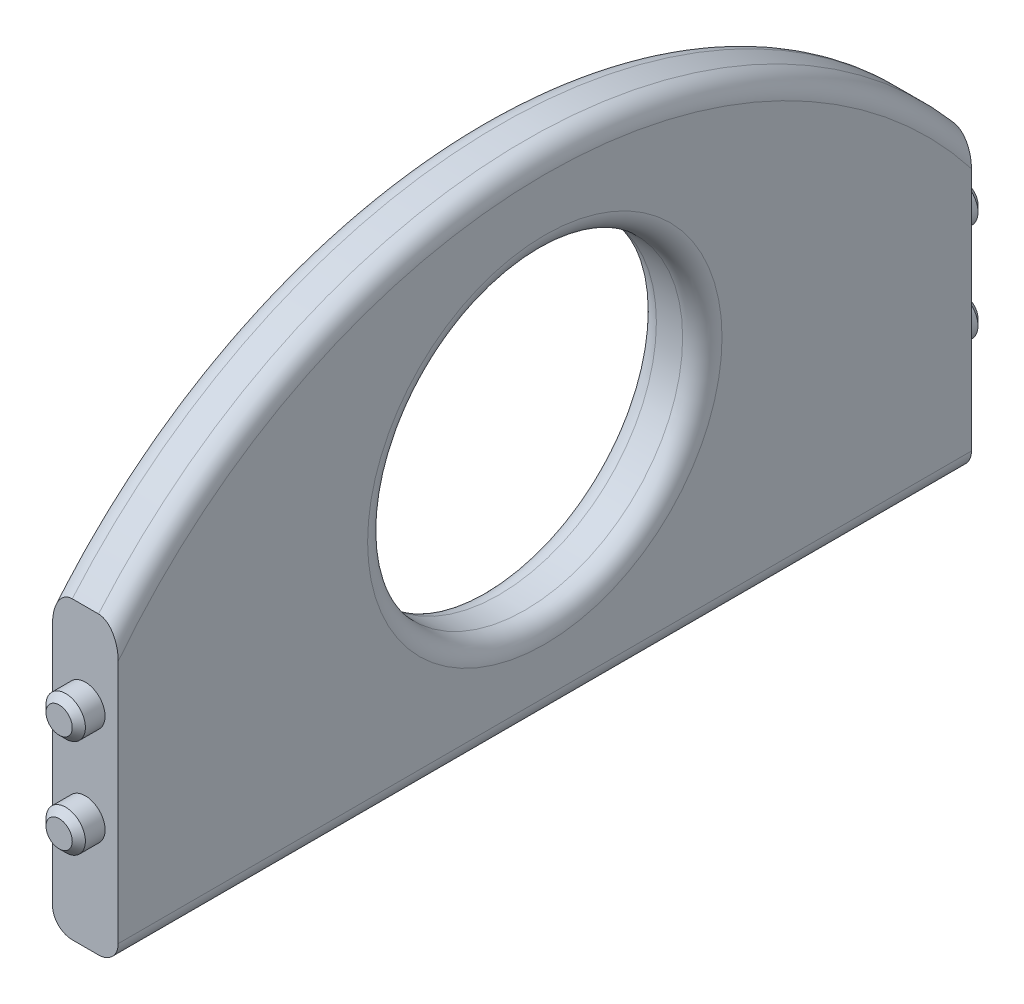
ISO-10303-21;
HEADER;
FILE_DESCRIPTION(('STEP AP214'),'2;1');
FILE_NAME('part.step','',(''),(''),'','','');
FILE_SCHEMA(('AUTOMOTIVE_DESIGN { 1 0 10303 214 1 1 1 1 }'));
ENDSEC;
DATA;
#1=APPLICATION_CONTEXT('core data for automotive mechanical design processes');
#2=APPLICATION_PROTOCOL_DEFINITION('international standard','automotive_design',2000,#1);
#3=PRODUCT_CONTEXT('',#1,'mechanical');
#4=PRODUCT('Part','Part','',(#3));
#5=PRODUCT_RELATED_PRODUCT_CATEGORY('part','',(#4));
#6=PRODUCT_DEFINITION_FORMATION('','',#4);
#7=PRODUCT_DEFINITION_CONTEXT('part definition',#1,'design');
#8=PRODUCT_DEFINITION('design','',#6,#7);
#9=PRODUCT_DEFINITION_SHAPE('','',#8);
#10=(LENGTH_UNIT() NAMED_UNIT(*) SI_UNIT(.MILLI.,.METRE.));
#11=(NAMED_UNIT(*) PLANE_ANGLE_UNIT() SI_UNIT($,.RADIAN.));
#12=(NAMED_UNIT(*) SI_UNIT($,.STERADIAN.) SOLID_ANGLE_UNIT());
#13=UNCERTAINTY_MEASURE_WITH_UNIT(LENGTH_MEASURE(1.E-05),#10,'distance_accuracy_value','');
#14=(GEOMETRIC_REPRESENTATION_CONTEXT(3) GLOBAL_UNCERTAINTY_ASSIGNED_CONTEXT((#13)) GLOBAL_UNIT_ASSIGNED_CONTEXT((#10,
#11,#12)) REPRESENTATION_CONTEXT('',''));
#15=CARTESIAN_POINT('',(0.,0.,0.));
#16=DIRECTION('',(0.,0.,1.));
#17=DIRECTION('',(1.,0.,0.));
#18=AXIS2_PLACEMENT_3D('',#15,#16,#17);
#19=CARTESIAN_POINT('',(5.,45.,65.));
#20=DIRECTION('',(0.,0.,-1.));
#21=DIRECTION('',(-1.,0.,0.));
#22=AXIS2_PLACEMENT_3D('',#19,#20,#21);
#23=PLANE('',#22);
#24=CARTESIAN_POINT('',(0.,32.,65.));
#25=DIRECTION('',(0.,0.,-1.));
#26=DIRECTION('',(-1.,0.,0.));
#27=AXIS2_PLACEMENT_3D('',#24,#25,#26);
#28=CIRCLE('',#27,3.);
#29=CARTESIAN_POINT('',(-3.,32.,65.));
#30=VERTEX_POINT('',#29);
#31=EDGE_CURVE('E245',#30,#30,#28,.F.);
#32=ORIENTED_EDGE('',*,*,#31,.F.);
#33=EDGE_LOOP('',(#32));
#34=FACE_BOUND('',#33,.T.);
#35=DIRECTION('',(0.,-1.,0.));
#36=VECTOR('',#35,1.);
#37=CARTESIAN_POINT('',(-5.,45.,65.));
#38=LINE('',#37,#36);
#39=CARTESIAN_POINT('',(-5.,40.2539060994314,65.));
#40=VERTEX_POINT('',#39);
#41=CARTESIAN_POINT('',(-5.,3.00000000000002,65.));
#42=VERTEX_POINT('',#41);
#43=EDGE_CURVE('E117',#40,#42,#38,.T.);
#44=ORIENTED_EDGE('',*,*,#43,.T.);
#45=CARTESIAN_POINT('',(-2.,3.,65.));
#46=DIRECTION('',(0.,0.,-1.));
#47=DIRECTION('',(-1.,0.,0.));
#48=AXIS2_PLACEMENT_3D('',#45,#46,#47);
#49=CIRCLE('',#48,3.);
#50=CARTESIAN_POINT('',(-2.,0.,65.));
#51=VERTEX_POINT('',#50);
#52=EDGE_CURVE('E121',#42,#51,#49,.F.);
#53=ORIENTED_EDGE('',*,*,#52,.T.);
#54=DIRECTION('',(-1.,0.,0.));
#55=VECTOR('',#54,1.);
#56=CARTESIAN_POINT('',(5.,0.,65.));
#57=LINE('',#56,#55);
#58=CARTESIAN_POINT('',(2.,0.,65.));
#59=VERTEX_POINT('',#58);
#60=EDGE_CURVE('E291',#59,#51,#57,.T.);
#61=ORIENTED_EDGE('',*,*,#60,.F.);
#62=CARTESIAN_POINT('',(2.,3.,65.));
#63=DIRECTION('',(0.,0.,-1.));
#64=DIRECTION('',(-1.,0.,0.));
#65=AXIS2_PLACEMENT_3D('',#62,#63,#64);
#66=CIRCLE('',#65,3.);
#67=CARTESIAN_POINT('',(5.,3.00000000000002,65.));
#68=VERTEX_POINT('',#67);
#69=EDGE_CURVE('E189',#59,#68,#66,.F.);
#70=ORIENTED_EDGE('',*,*,#69,.T.);
#71=DIRECTION('',(0.,-1.,0.));
#72=VECTOR('',#71,1.);
#73=CARTESIAN_POINT('',(5.,45.,65.));
#74=LINE('',#73,#72);
#75=CARTESIAN_POINT('',(5.,40.2539060994314,65.));
#76=VERTEX_POINT('',#75);
#77=EDGE_CURVE('E116',#76,#68,#74,.T.);
#78=ORIENTED_EDGE('',*,*,#77,.F.);
#79=CARTESIAN_POINT('',(5.,40.2539060994314,65.));
#80=CARTESIAN_POINT('',(4.99999557512889,40.358503037264,65.));
#81=CARTESIAN_POINT('',(4.99793249668532,40.463089252755,65.));
#82=CARTESIAN_POINT('',(4.98960836084726,40.6721091068507,65.));
#83=CARTESIAN_POINT('',(4.98334669464615,40.7765427211265,65.));
#84=CARTESIAN_POINT('',(4.95809486676426,41.0899779035369,65.));
#85=CARTESIAN_POINT('',(4.93263689556529,41.2985046166608,65.));
#86=CARTESIAN_POINT('',(4.86305788857343,41.7152133252635,65.));
#87=CARTESIAN_POINT('',(4.81869880997356,41.9233556863235,65.));
#88=CARTESIAN_POINT('',(4.7097917309633,42.3341019363939,65.));
#89=CARTESIAN_POINT('',(4.64527425385712,42.5367136986623,65.));
#90=CARTESIAN_POINT('',(4.53130442027821,42.8355112970627,65.));
#91=CARTESIAN_POINT('',(4.49012523695941,42.9348832731109,65.));
#92=CARTESIAN_POINT('',(4.40171558662986,43.1308826903725,65.));
#93=CARTESIAN_POINT('',(4.35448512121664,43.2275101323103,65.));
#94=CARTESIAN_POINT('',(4.20344490498561,43.5117804961347,65.));
#95=CARTESIAN_POINT('',(4.09001177791011,43.6945541106818,65.));
#96=CARTESIAN_POINT('',(3.86128731810569,44.0031251505772,65.));
#97=CARTESIAN_POINT('',(3.75132018299894,44.1328543499134,65.));
#98=CARTESIAN_POINT('',(3.51224649724888,44.3735584253075,65.));
#99=CARTESIAN_POINT('',(3.38316325361085,44.4845557921009,65.));
#100=CARTESIAN_POINT('',(3.14167079747046,44.65503961727,65.));
#101=CARTESIAN_POINT('',(3.03345323093964,44.7204384803285,65.));
#102=CARTESIAN_POINT('',(2.80795674547336,44.8327361943593,65.));
#103=CARTESIAN_POINT('',(2.69070184076297,44.8796821806632,65.));
#104=CARTESIAN_POINT('',(2.47800455284486,44.9432071105622,65.));
#105=CARTESIAN_POINT('',(2.38392276444152,44.9643324850905,65.));
#106=CARTESIAN_POINT('',(2.24106594304823,44.985641779761,65.));
#107=CARTESIAN_POINT('',(2.19302910838295,44.9910154229132,65.));
#108=CARTESIAN_POINT('',(2.0966668426286,44.9981983050912,65.));
#109=CARTESIAN_POINT('',(2.04834128339406,45.0000058218478,65.));
#110=CARTESIAN_POINT('',(1.99999999999999,45.,65.));
#111=B_SPLINE_CURVE_WITH_KNOTS('',3,(#79,#80,#81,#82,#83,#84,#85,#86,#87,#88,#89,#90,#91,#92,
#93,#94,#95,#96,#97,#98,#99,#100,#101,#102,#103,#104,#105,#106,#107,#108,#109,#110),
.UNSPECIFIED.,.F.,.F.,(4,2,2,2,2,2,2,2,2,2,2,2,2,2,2,4),(0.,0.313747347509962,0.627540199078271,
1.25694811834142,1.89452873816713,2.53114859121832,2.85366100302497,3.17617332968922,
3.81883898489307,4.32743607327599,4.83541809178389,5.21335056154837,5.5903112818404,
5.87856031813861,6.02345035566749,6.16841035107215),.UNSPECIFIED.);
#112=CARTESIAN_POINT('',(2.,45.,65.));
#113=VERTEX_POINT('',#112);
#114=EDGE_CURVE('E53',#76,#113,#111,.T.);
#115=ORIENTED_EDGE('',*,*,#114,.T.);
#116=DIRECTION('',(-1.,0.,0.));
#117=VECTOR('',#116,1.);
#118=CARTESIAN_POINT('',(5.,45.,65.));
#119=LINE('',#118,#117);
#120=CARTESIAN_POINT('',(-2.,45.,65.));
#121=VERTEX_POINT('',#120);
#122=EDGE_CURVE('E294',#113,#121,#119,.T.);
#123=ORIENTED_EDGE('',*,*,#122,.T.);
#124=CARTESIAN_POINT('',(-2.,45.,65.));
#125=CARTESIAN_POINT('',(-2.06392126640894,45.0000267211741,65.));
#126=CARTESIAN_POINT('',(-2.12782747482795,44.9968520452714,65.));
#127=CARTESIAN_POINT('',(-2.25496824562338,44.9843063047697,65.));
#128=CARTESIAN_POINT('',(-2.31820340106259,44.9749412728637,65.));
#129=CARTESIAN_POINT('',(-2.44286511651599,44.9503432399189,65.));
#130=CARTESIAN_POINT('',(-2.50430340096096,44.9351694353523,65.));
#131=CARTESIAN_POINT('',(-2.62554057380993,44.8993114784193,65.));
#132=CARTESIAN_POINT('',(-2.6853391602702,44.8786263185757,65.));
#133=CARTESIAN_POINT('',(-2.8612169767861,44.8090943986946,65.));
#134=CARTESIAN_POINT('',(-2.9743612093811,44.7526502960175,65.));
#135=CARTESIAN_POINT('',(-3.19084573538722,44.62316316115,65.));
#136=CARTESIAN_POINT('',(-3.29415877600119,44.550075790073,65.));
#137=CARTESIAN_POINT('',(-3.53661303502993,44.3531937617851,65.));
#138=CARTESIAN_POINT('',(-3.66955623060055,44.2217754528407,65.));
#139=CARTESIAN_POINT('',(-3.9130673124227,43.9397203122878,65.));
#140=CARTESIAN_POINT('',(-4.02359247305606,43.7890476587017,65.));
#141=CARTESIAN_POINT('',(-4.19964504984708,43.5130223834481,65.));
#142=CARTESIAN_POINT('',(-4.26957937305046,43.3904203461238,65.));
#143=CARTESIAN_POINT('',(-4.39856949860749,43.1395646560619,65.));
#144=CARTESIAN_POINT('',(-4.45761952900372,43.011308049114,65.));
#145=CARTESIAN_POINT('',(-4.56574401096742,42.7502601130642,65.));
#146=CARTESIAN_POINT('',(-4.61478920836524,42.6174567750004,65.));
#147=CARTESIAN_POINT('',(-4.70339719658358,42.3487159976025,65.));
#148=CARTESIAN_POINT('',(-4.74295805977474,42.2127779272982,65.));
#149=CARTESIAN_POINT('',(-4.81631660482326,41.9263401714282,65.));
#150=CARTESIAN_POINT('',(-4.84927964588775,41.7756276002522,65.));
#151=CARTESIAN_POINT('',(-4.90523355307502,41.4723426177178,65.));
#152=CARTESIAN_POINT('',(-4.9282220683093,41.3197697766158,65.));
#153=CARTESIAN_POINT('',(-4.96448608276865,41.0151796570805,65.));
#154=CARTESIAN_POINT('',(-4.97786514940977,40.8631745789006,65.));
#155=CARTESIAN_POINT('',(-4.99560850425527,40.558741576983,65.));
#156=CARTESIAN_POINT('',(-4.99997902805219,40.4063140189097,65.));
#157=CARTESIAN_POINT('',(-5.,40.2539060994314,65.));
#158=B_SPLINE_CURVE_WITH_KNOTS('',3,(#124,#125,#126,#127,#128,#129,#130,#131,#132,#133,#134,
#135,#136,#137,#138,#139,#140,#141,#142,#143,#144,#145,#146,#147,#148,#149,#150,#151,#152,#153,
#154,#155,#156,#157),.UNSPECIFIED.,.F.,.F.,(4,2,2,2,2,2,2,2,2,2,2,2,2,2,2,2,4),(0.,
0.191660629776799,0.383134755178901,0.572707412818286,0.762314748195104,1.13976828468685,
1.51823939958654,2.07591444428037,2.63464255380856,3.0575264904984,3.48063404203282,
3.90496156727915,4.32937526136617,4.79183817404127,5.25441002512357,5.71191840852826,
6.16911000427321),.UNSPECIFIED.);
#159=EDGE_CURVE('E46',#121,#40,#158,.T.);
#160=ORIENTED_EDGE('',*,*,#159,.T.);
#161=EDGE_LOOP('',(#44,#53,#61,#70,#78,#115,#123,#160));
#162=FACE_BOUND('',#161,.T.);
#163=CARTESIAN_POINT('',(0.,17.,65.));
#164=DIRECTION('',(0.,0.,-1.));
#165=DIRECTION('',(-1.,0.,0.));
#166=AXIS2_PLACEMENT_3D('',#163,#164,#165);
#167=CIRCLE('',#166,3.);
#168=CARTESIAN_POINT('',(-3.,17.,65.));
#169=VERTEX_POINT('',#168);
#170=EDGE_CURVE('E240',#169,#169,#167,.F.);
#171=ORIENTED_EDGE('',*,*,#170,.F.);
#172=EDGE_LOOP('',(#171));
#173=FACE_BOUND('',#172,.T.);
#174=ADVANCED_FACE('F30',(#34,#162,#173),#23,.F.);
#175=CARTESIAN_POINT('',(5.,-10.4166666666667,0.));
#176=DIRECTION('',(-1.,0.,0.));
#177=DIRECTION('',(0.,0.,1.));
#178=AXIS2_PLACEMENT_3D('',#175,#176,#177);
#179=PLANE('',#178);
#180=CARTESIAN_POINT('',(5.,37.,0.));
#181=DIRECTION('',(-1.,0.,0.));
#182=DIRECTION('',(0.,0.,1.));
#183=AXIS2_PLACEMENT_3D('',#180,#181,#182);
#184=CIRCLE('',#183,27.);
#185=CARTESIAN_POINT('',(5.,37.,27.));
#186=VERTEX_POINT('',#185);
#187=EDGE_CURVE('E142',#186,#186,#184,.T.);
#188=ORIENTED_EDGE('',*,*,#187,.T.);
#189=EDGE_LOOP('',(#188));
#190=FACE_BOUND('',#189,.T.);
#191=ORIENTED_EDGE('',*,*,#77,.T.);
#192=DIRECTION('',(0.,0.,-1.));
#193=VECTOR('',#192,1.);
#194=CARTESIAN_POINT('',(5.,3.,0.));
#195=LINE('',#194,#193);
#196=CARTESIAN_POINT('',(5.,3.00000000000002,-65.));
#197=VERTEX_POINT('',#196);
#198=EDGE_CURVE('E139',#68,#197,#195,.T.);
#199=ORIENTED_EDGE('',*,*,#198,.T.);
#200=DIRECTION('',(0.,1.,0.));
#201=VECTOR('',#200,1.);
#202=CARTESIAN_POINT('',(5.,45.,-65.));
#203=LINE('',#202,#201);
#204=CARTESIAN_POINT('',(5.,40.2539060994314,-65.));
#205=VERTEX_POINT('',#204);
#206=EDGE_CURVE('E284',#197,#205,#203,.T.);
#207=ORIENTED_EDGE('',*,*,#206,.T.);
#208=CARTESIAN_POINT('',(5.,-10.4166666666667,0.));
#209=DIRECTION('',(-1.,0.,0.));
#210=DIRECTION('',(0.,0.,1.));
#211=AXIS2_PLACEMENT_3D('',#208,#209,#210);
#212=CIRCLE('',#211,82.4166666666667);
#213=EDGE_CURVE('E136',#205,#76,#212,.F.);
#214=ORIENTED_EDGE('',*,*,#213,.T.);
#215=EDGE_LOOP('',(#191,#199,#207,#214));
#216=FACE_BOUND('',#215,.T.);
#217=ADVANCED_FACE('F176',(#190,#216),#179,.F.);
#218=CARTESIAN_POINT('',(-5.,-10.4166666666667,0.));
#219=DIRECTION('',(-1.,0.,0.));
#220=DIRECTION('',(0.,0.,1.));
#221=AXIS2_PLACEMENT_3D('',#218,#219,#220);
#222=PLANE('',#221);
#223=CARTESIAN_POINT('',(-5.,37.,0.));
#224=DIRECTION('',(-1.,0.,0.));
#225=DIRECTION('',(0.,0.,1.));
#226=AXIS2_PLACEMENT_3D('',#223,#224,#225);
#227=CIRCLE('',#226,27.);
#228=CARTESIAN_POINT('',(-5.,37.,27.));
#229=VERTEX_POINT('',#228);
#230=EDGE_CURVE('E122',#229,#229,#227,.F.);
#231=ORIENTED_EDGE('',*,*,#230,.T.);
#232=EDGE_LOOP('',(#231));
#233=FACE_BOUND('',#232,.T.);
#234=DIRECTION('',(0.,1.,0.));
#235=VECTOR('',#234,1.);
#236=CARTESIAN_POINT('',(-5.,45.,-65.));
#237=LINE('',#236,#235);
#238=CARTESIAN_POINT('',(-5.,3.00000000000002,-65.));
#239=VERTEX_POINT('',#238);
#240=CARTESIAN_POINT('',(-5.,40.2539060994314,-65.));
#241=VERTEX_POINT('',#240);
#242=EDGE_CURVE('E100',#239,#241,#237,.T.);
#243=ORIENTED_EDGE('',*,*,#242,.F.);
#244=DIRECTION('',(0.,0.,-1.));
#245=VECTOR('',#244,1.);
#246=CARTESIAN_POINT('',(-5.,3.,65.));
#247=LINE('',#246,#245);
#248=EDGE_CURVE('E113',#239,#42,#247,.F.);
#249=ORIENTED_EDGE('',*,*,#248,.T.);
#250=ORIENTED_EDGE('',*,*,#43,.F.);
#251=CARTESIAN_POINT('',(-5.,-10.4166666666667,0.));
#252=DIRECTION('',(-1.,0.,0.));
#253=DIRECTION('',(0.,0.,1.));
#254=AXIS2_PLACEMENT_3D('',#251,#252,#253);
#255=CIRCLE('',#254,82.4166666666667);
#256=EDGE_CURVE('E115',#40,#241,#255,.T.);
#257=ORIENTED_EDGE('',*,*,#256,.T.);
#258=EDGE_LOOP('',(#243,#249,#250,#257));
#259=FACE_BOUND('',#258,.T.);
#260=ADVANCED_FACE('F111',(#233,#259),#222,.T.);
#261=CARTESIAN_POINT('',(5.,-10.4166666666667,0.));
#262=DIRECTION('',(-1.,0.,0.));
#263=DIRECTION('',(0.,0.,1.));
#264=AXIS2_PLACEMENT_3D('',#261,#262,#263);
#265=CYLINDRICAL_SURFACE('',#264,85.4166666666667);
#266=DIRECTION('',(-1.,0.,0.));
#267=VECTOR('',#266,1.);
#268=CARTESIAN_POINT('',(5.,45.,-65.));
#269=LINE('',#268,#267);
#270=CARTESIAN_POINT('',(2.,45.,-65.));
#271=VERTEX_POINT('',#270);
#272=CARTESIAN_POINT('',(-2.,45.,-65.));
#273=VERTEX_POINT('',#272);
#274=EDGE_CURVE('E286',#271,#273,#269,.T.);
#275=ORIENTED_EDGE('',*,*,#274,.T.);
#276=CARTESIAN_POINT('',(-2.,-10.4166666666667,0.));
#277=DIRECTION('',(-1.,0.,0.));
#278=DIRECTION('',(0.,0.,1.));
#279=AXIS2_PLACEMENT_3D('',#276,#277,#278);
#280=CIRCLE('',#279,85.4166666666667);
#281=EDGE_CURVE('E11',#273,#121,#280,.F.);
#282=ORIENTED_EDGE('',*,*,#281,.T.);
#283=ORIENTED_EDGE('',*,*,#122,.F.);
#284=CARTESIAN_POINT('',(2.,-10.4166666666667,0.));
#285=DIRECTION('',(-1.,0.,0.));
#286=DIRECTION('',(0.,0.,1.));
#287=AXIS2_PLACEMENT_3D('',#284,#285,#286);
#288=CIRCLE('',#287,85.4166666666667);
#289=EDGE_CURVE('E39',#113,#271,#288,.T.);
#290=ORIENTED_EDGE('',*,*,#289,.T.);
#291=EDGE_LOOP('',(#275,#282,#283,#290));
#292=FACE_BOUND('',#291,.T.);
#293=ADVANCED_FACE('F171',(#292),#265,.T.);
#294=CARTESIAN_POINT('',(5.,0.,65.));
#295=DIRECTION('',(0.,1.,0.));
#296=DIRECTION('',(0.,0.,1.));
#297=AXIS2_PLACEMENT_3D('',#294,#295,#296);
#298=PLANE('',#297);
#299=ORIENTED_EDGE('',*,*,#60,.T.);
#300=DIRECTION('',(0.,0.,-1.));
#301=VECTOR('',#300,1.);
#302=CARTESIAN_POINT('',(-2.,0.,-65.));
#303=LINE('',#302,#301);
#304=CARTESIAN_POINT('',(-2.,0.,-65.));
#305=VERTEX_POINT('',#304);
#306=EDGE_CURVE('E147',#51,#305,#303,.T.);
#307=ORIENTED_EDGE('',*,*,#306,.T.);
#308=DIRECTION('',(-1.,0.,0.));
#309=VECTOR('',#308,1.);
#310=CARTESIAN_POINT('',(5.,0.,-65.));
#311=LINE('',#310,#309);
#312=CARTESIAN_POINT('',(2.,0.,-65.));
#313=VERTEX_POINT('',#312);
#314=EDGE_CURVE('E103',#313,#305,#311,.T.);
#315=ORIENTED_EDGE('',*,*,#314,.F.);
#316=DIRECTION('',(0.,0.,-1.));
#317=VECTOR('',#316,1.);
#318=CARTESIAN_POINT('',(2.,0.,65.));
#319=LINE('',#318,#317);
#320=EDGE_CURVE('E145',#313,#59,#319,.F.);
#321=ORIENTED_EDGE('',*,*,#320,.T.);
#322=EDGE_LOOP('',(#299,#307,#315,#321));
#323=FACE_BOUND('',#322,.T.);
#324=ADVANCED_FACE('F165',(#323),#298,.F.);
#325=CARTESIAN_POINT('',(5.,45.,-65.));
#326=DIRECTION('',(0.,0.,1.));
#327=DIRECTION('',(1.,0.,0.));
#328=AXIS2_PLACEMENT_3D('',#325,#326,#327);
#329=PLANE('',#328);
#330=CARTESIAN_POINT('',(0.,17.,-65.));
#331=DIRECTION('',(0.,0.,1.));
#332=DIRECTION('',(1.,0.,0.));
#333=AXIS2_PLACEMENT_3D('',#330,#331,#332);
#334=CIRCLE('',#333,3.);
#335=CARTESIAN_POINT('',(3.,17.,-65.));
#336=VERTEX_POINT('',#335);
#337=EDGE_CURVE('E276',#336,#336,#334,.T.);
#338=ORIENTED_EDGE('',*,*,#337,.T.);
#339=EDGE_LOOP('',(#338));
#340=FACE_BOUND('',#339,.T.);
#341=CARTESIAN_POINT('',(0.,32.,-65.));
#342=DIRECTION('',(0.,0.,1.));
#343=DIRECTION('',(1.,0.,0.));
#344=AXIS2_PLACEMENT_3D('',#341,#342,#343);
#345=CIRCLE('',#344,3.);
#346=CARTESIAN_POINT('',(3.,32.,-65.));
#347=VERTEX_POINT('',#346);
#348=EDGE_CURVE('E274',#347,#347,#345,.T.);
#349=ORIENTED_EDGE('',*,*,#348,.T.);
#350=EDGE_LOOP('',(#349));
#351=FACE_BOUND('',#350,.T.);
#352=ORIENTED_EDGE('',*,*,#314,.T.);
#353=CARTESIAN_POINT('',(-2.,3.,-65.));
#354=DIRECTION('',(0.,0.,1.));
#355=DIRECTION('',(1.,0.,0.));
#356=AXIS2_PLACEMENT_3D('',#353,#354,#355);
#357=CIRCLE('',#356,3.);
#358=EDGE_CURVE('E97',#305,#239,#357,.F.);
#359=ORIENTED_EDGE('',*,*,#358,.T.);
#360=ORIENTED_EDGE('',*,*,#242,.T.);
#361=CARTESIAN_POINT('',(-5.,40.2539060994314,-65.));
#362=CARTESIAN_POINT('',(-4.99999557512889,40.358503037264,-65.));
#363=CARTESIAN_POINT('',(-4.99793249668532,40.463089252755,-65.));
#364=CARTESIAN_POINT('',(-4.98960836084726,40.6721091068507,-65.));
#365=CARTESIAN_POINT('',(-4.98334669464615,40.7765427211265,-65.));
#366=CARTESIAN_POINT('',(-4.95809486676426,41.0899779035369,-65.));
#367=CARTESIAN_POINT('',(-4.93263689556529,41.2985046166608,-65.));
#368=CARTESIAN_POINT('',(-4.86305788857343,41.7152133252635,-65.));
#369=CARTESIAN_POINT('',(-4.81869880997356,41.9233556863235,-65.));
#370=CARTESIAN_POINT('',(-4.7097917309633,42.3341019363939,-65.));
#371=CARTESIAN_POINT('',(-4.64527425385712,42.5367136986623,-65.));
#372=CARTESIAN_POINT('',(-4.53130442027821,42.8355112970627,-65.));
#373=CARTESIAN_POINT('',(-4.49012523695941,42.9348832731109,-65.));
#374=CARTESIAN_POINT('',(-4.40171558662986,43.1308826903725,-65.));
#375=CARTESIAN_POINT('',(-4.35448512121664,43.2275101323103,-65.));
#376=CARTESIAN_POINT('',(-4.20344490498561,43.5117804961347,-65.));
#377=CARTESIAN_POINT('',(-4.09001177791011,43.6945541106818,-65.));
#378=CARTESIAN_POINT('',(-3.86128731810569,44.0031251505772,-65.));
#379=CARTESIAN_POINT('',(-3.75132018299894,44.1328543499134,-65.));
#380=CARTESIAN_POINT('',(-3.51224649724888,44.3735584253075,-65.));
#381=CARTESIAN_POINT('',(-3.38316325361085,44.4845557921009,-65.));
#382=CARTESIAN_POINT('',(-3.14167079747046,44.65503961727,-65.));
#383=CARTESIAN_POINT('',(-3.03345323093964,44.7204384803285,-65.));
#384=CARTESIAN_POINT('',(-2.80795674547336,44.8327361943593,-65.));
#385=CARTESIAN_POINT('',(-2.69070184076297,44.8796821806632,-65.));
#386=CARTESIAN_POINT('',(-2.47800455284486,44.9432071105622,-65.));
#387=CARTESIAN_POINT('',(-2.38392276444152,44.9643324850905,-65.));
#388=CARTESIAN_POINT('',(-2.24106594304823,44.985641779761,-65.));
#389=CARTESIAN_POINT('',(-2.19302910838295,44.9910154229132,-65.));
#390=CARTESIAN_POINT('',(-2.0966668426286,44.9981983050912,-65.));
#391=CARTESIAN_POINT('',(-2.04834128339406,45.0000058218478,-65.));
#392=CARTESIAN_POINT('',(-1.99999999999999,45.,-65.));
#393=B_SPLINE_CURVE_WITH_KNOTS('',3,(#361,#362,#363,#364,#365,#366,#367,#368,#369,#370,#371,
#372,#373,#374,#375,#376,#377,#378,#379,#380,#381,#382,#383,#384,#385,#386,#387,#388,#389,#390,
#391,#392),.UNSPECIFIED.,.F.,.F.,(4,2,2,2,2,2,2,2,2,2,2,2,2,2,2,4),(0.,0.313747347509962,
0.627540199078271,1.25694811834142,1.89452873816713,2.53114859121832,2.85366100302497,
3.17617332968922,3.81883898489307,4.32743607327599,4.83541809178389,5.21335056154837,
5.5903112818404,5.87856031813861,6.02345035566749,6.16841035107215),.UNSPECIFIED.);
#394=EDGE_CURVE('E155',#241,#273,#393,.T.);
#395=ORIENTED_EDGE('',*,*,#394,.T.);
#396=ORIENTED_EDGE('',*,*,#274,.F.);
#397=CARTESIAN_POINT('',(2.,45.,-65.));
#398=CARTESIAN_POINT('',(2.06392126640894,45.0000267211741,-65.));
#399=CARTESIAN_POINT('',(2.12782747482795,44.9968520452714,-65.));
#400=CARTESIAN_POINT('',(2.25496824562338,44.9843063047697,-65.));
#401=CARTESIAN_POINT('',(2.31820340106259,44.9749412728637,-65.));
#402=CARTESIAN_POINT('',(2.44286511651599,44.9503432399189,-65.));
#403=CARTESIAN_POINT('',(2.50430340096096,44.9351694353523,-65.));
#404=CARTESIAN_POINT('',(2.62554057380993,44.8993114784193,-65.));
#405=CARTESIAN_POINT('',(2.6853391602702,44.8786263185757,-65.));
#406=CARTESIAN_POINT('',(2.8612169767861,44.8090943986946,-65.));
#407=CARTESIAN_POINT('',(2.9743612093811,44.7526502960175,-65.));
#408=CARTESIAN_POINT('',(3.19084573538722,44.62316316115,-65.));
#409=CARTESIAN_POINT('',(3.29415877600119,44.550075790073,-65.));
#410=CARTESIAN_POINT('',(3.53661303502993,44.3531937617851,-65.));
#411=CARTESIAN_POINT('',(3.66955623060055,44.2217754528407,-65.));
#412=CARTESIAN_POINT('',(3.9130673124227,43.9397203122878,-65.));
#413=CARTESIAN_POINT('',(4.02359247305606,43.7890476587017,-65.));
#414=CARTESIAN_POINT('',(4.19964504984708,43.5130223834481,-65.));
#415=CARTESIAN_POINT('',(4.26957937305046,43.3904203461238,-65.));
#416=CARTESIAN_POINT('',(4.39856949860749,43.1395646560619,-65.));
#417=CARTESIAN_POINT('',(4.45761952900372,43.011308049114,-65.));
#418=CARTESIAN_POINT('',(4.56574401096742,42.7502601130642,-65.));
#419=CARTESIAN_POINT('',(4.61478920836524,42.6174567750004,-65.));
#420=CARTESIAN_POINT('',(4.70339719658358,42.3487159976025,-65.));
#421=CARTESIAN_POINT('',(4.74295805977474,42.2127779272982,-65.));
#422=CARTESIAN_POINT('',(4.81631660482326,41.9263401714282,-65.));
#423=CARTESIAN_POINT('',(4.84927964588775,41.7756276002522,-65.));
#424=CARTESIAN_POINT('',(4.90523355307502,41.4723426177178,-65.));
#425=CARTESIAN_POINT('',(4.9282220683093,41.3197697766158,-65.));
#426=CARTESIAN_POINT('',(4.96448608276865,41.0151796570805,-65.));
#427=CARTESIAN_POINT('',(4.97786514940977,40.8631745789006,-65.));
#428=CARTESIAN_POINT('',(4.99560850425527,40.558741576983,-65.));
#429=CARTESIAN_POINT('',(4.99997902805219,40.4063140189097,-65.));
#430=CARTESIAN_POINT('',(5.,40.2539060994314,-65.));
#431=B_SPLINE_CURVE_WITH_KNOTS('',3,(#397,#398,#399,#400,#401,#402,#403,#404,#405,#406,#407,
#408,#409,#410,#411,#412,#413,#414,#415,#416,#417,#418,#419,#420,#421,#422,#423,#424,#425,#426,
#427,#428,#429,#430),.UNSPECIFIED.,.F.,.F.,(4,2,2,2,2,2,2,2,2,2,2,2,2,2,2,2,4),(0.,
0.191660629776799,0.383134755178901,0.572707412818286,0.762314748195104,1.13976828468685,
1.51823939958654,2.07591444428037,2.63464255380856,3.0575264904984,3.48063404203282,
3.90496156727915,4.32937526136617,4.79183817404127,5.25441002512357,5.71191840852826,
6.16911000427321),.UNSPECIFIED.);
#432=EDGE_CURVE('E149',#271,#205,#431,.T.);
#433=ORIENTED_EDGE('',*,*,#432,.T.);
#434=ORIENTED_EDGE('',*,*,#206,.F.);
#435=CARTESIAN_POINT('',(2.,3.,-65.));
#436=DIRECTION('',(0.,0.,1.));
#437=DIRECTION('',(1.,0.,0.));
#438=AXIS2_PLACEMENT_3D('',#435,#436,#437);
#439=CIRCLE('',#438,3.);
#440=EDGE_CURVE('E108',#197,#313,#439,.F.);
#441=ORIENTED_EDGE('',*,*,#440,.T.);
#442=EDGE_LOOP('',(#352,#359,#360,#395,#396,#433,#434,#441));
#443=FACE_BOUND('',#442,.T.);
#444=ADVANCED_FACE('F99',(#340,#351,#443),#329,.F.);
#445=CARTESIAN_POINT('',(5.,37.,0.));
#446=DIRECTION('',(-1.,0.,0.));
#447=DIRECTION('',(0.,0.,1.));
#448=AXIS2_PLACEMENT_3D('',#445,#446,#447);
#449=CYLINDRICAL_SURFACE('',#448,24.);
#450=CARTESIAN_POINT('',(-2.,37.,0.));
#451=DIRECTION('',(-1.,0.,0.));
#452=DIRECTION('',(0.,0.,1.));
#453=AXIS2_PLACEMENT_3D('',#450,#451,#452);
#454=CIRCLE('',#453,24.);
#455=CARTESIAN_POINT('',(-2.,37.,24.));
#456=VERTEX_POINT('',#455);
#457=EDGE_CURVE('E133',#456,#456,#454,.T.);
#458=ORIENTED_EDGE('',*,*,#457,.T.);
#459=EDGE_LOOP('',(#458));
#460=FACE_BOUND('',#459,.T.);
#461=CARTESIAN_POINT('',(2.,37.,0.));
#462=DIRECTION('',(-1.,0.,0.));
#463=DIRECTION('',(0.,0.,1.));
#464=AXIS2_PLACEMENT_3D('',#461,#462,#463);
#465=CIRCLE('',#464,24.);
#466=CARTESIAN_POINT('',(2.,37.,24.));
#467=VERTEX_POINT('',#466);
#468=EDGE_CURVE('E125',#467,#467,#465,.F.);
#469=ORIENTED_EDGE('',*,*,#468,.T.);
#470=EDGE_LOOP('',(#469));
#471=FACE_BOUND('',#470,.T.);
#472=ADVANCED_FACE('F164',(#460,#471),#449,.F.);
#473=CARTESIAN_POINT('',(0.,32.,69.));
#474=DIRECTION('',(0.,0.,-1.));
#475=DIRECTION('',(-1.,0.,0.));
#476=AXIS2_PLACEMENT_3D('',#473,#474,#475);
#477=CYLINDRICAL_SURFACE('',#476,3.);
#478=CARTESIAN_POINT('',(0.,32.,68.));
#479=DIRECTION('',(0.,0.,1.));
#480=DIRECTION('',(1.,0.,0.));
#481=AXIS2_PLACEMENT_3D('',#478,#479,#480);
#482=CIRCLE('',#481,3.);
#483=CARTESIAN_POINT('',(3.,32.,68.));
#484=VERTEX_POINT('',#483);
#485=EDGE_CURVE('E251',#484,#484,#482,.F.);
#486=ORIENTED_EDGE('',*,*,#485,.T.);
#487=EDGE_LOOP('',(#486));
#488=FACE_BOUND('',#487,.T.);
#489=ORIENTED_EDGE('',*,*,#31,.T.);
#490=EDGE_LOOP('',(#489));
#491=FACE_BOUND('',#490,.T.);
#492=ADVANCED_FACE('F298',(#488,#491),#477,.T.);
#493=CARTESIAN_POINT('',(0.,32.,69.));
#494=DIRECTION('',(0.,0.,1.));
#495=DIRECTION('',(1.,0.,0.));
#496=AXIS2_PLACEMENT_3D('',#493,#494,#495);
#497=PLANE('',#496);
#498=CARTESIAN_POINT('',(0.,32.,69.));
#499=DIRECTION('',(0.,0.,1.));
#500=DIRECTION('',(1.,0.,0.));
#501=AXIS2_PLACEMENT_3D('',#498,#499,#500);
#502=CIRCLE('',#501,2.);
#503=CARTESIAN_POINT('',(2.,32.,69.));
#504=VERTEX_POINT('',#503);
#505=EDGE_CURVE('E242',#504,#504,#502,.T.);
#506=ORIENTED_EDGE('',*,*,#505,.T.);
#507=EDGE_LOOP('',(#506));
#508=FACE_BOUND('',#507,.T.);
#509=ADVANCED_FACE('F303',(#508),#497,.T.);
#510=CARTESIAN_POINT('',(0.,17.,69.));
#511=DIRECTION('',(0.,0.,-1.));
#512=DIRECTION('',(-1.,0.,0.));
#513=AXIS2_PLACEMENT_3D('',#510,#511,#512);
#514=CYLINDRICAL_SURFACE('',#513,3.);
#515=CARTESIAN_POINT('',(0.,17.,68.));
#516=DIRECTION('',(0.,0.,1.));
#517=DIRECTION('',(1.,0.,0.));
#518=AXIS2_PLACEMENT_3D('',#515,#516,#517);
#519=CIRCLE('',#518,3.);
#520=CARTESIAN_POINT('',(3.,17.,68.));
#521=VERTEX_POINT('',#520);
#522=EDGE_CURVE('E236',#521,#521,#519,.F.);
#523=ORIENTED_EDGE('',*,*,#522,.T.);
#524=EDGE_LOOP('',(#523));
#525=FACE_BOUND('',#524,.T.);
#526=ORIENTED_EDGE('',*,*,#170,.T.);
#527=EDGE_LOOP('',(#526));
#528=FACE_BOUND('',#527,.T.);
#529=ADVANCED_FACE('F230',(#525,#528),#514,.T.);
#530=CARTESIAN_POINT('',(0.,17.,69.));
#531=DIRECTION('',(0.,0.,1.));
#532=DIRECTION('',(1.,0.,0.));
#533=AXIS2_PLACEMENT_3D('',#530,#531,#532);
#534=PLANE('',#533);
#535=CARTESIAN_POINT('',(0.,17.,69.));
#536=DIRECTION('',(0.,0.,1.));
#537=DIRECTION('',(1.,0.,0.));
#538=AXIS2_PLACEMENT_3D('',#535,#536,#537);
#539=CIRCLE('',#538,2.);
#540=CARTESIAN_POINT('',(2.,17.,69.));
#541=VERTEX_POINT('',#540);
#542=EDGE_CURVE('E239',#541,#541,#539,.T.);
#543=ORIENTED_EDGE('',*,*,#542,.T.);
#544=EDGE_LOOP('',(#543));
#545=FACE_BOUND('',#544,.T.);
#546=ADVANCED_FACE('F225',(#545),#534,.T.);
#547=CARTESIAN_POINT('',(0.,17.,69.));
#548=DIRECTION('',(0.,0.,-1.));
#549=DIRECTION('',(-1.,0.,0.));
#550=AXIS2_PLACEMENT_3D('',#547,#548,#549);
#551=CONICAL_SURFACE('',#550,2.,0.785398163397447);
#552=ORIENTED_EDGE('',*,*,#522,.F.);
#553=EDGE_LOOP('',(#552));
#554=FACE_BOUND('',#553,.T.);
#555=ORIENTED_EDGE('',*,*,#542,.F.);
#556=EDGE_LOOP('',(#555));
#557=FACE_BOUND('',#556,.T.);
#558=ADVANCED_FACE('F222',(#554,#557),#551,.T.);
#559=CARTESIAN_POINT('',(0.,32.,69.));
#560=DIRECTION('',(0.,0.,-1.));
#561=DIRECTION('',(-1.,0.,0.));
#562=AXIS2_PLACEMENT_3D('',#559,#560,#561);
#563=CONICAL_SURFACE('',#562,2.,0.785398163397448);
#564=ORIENTED_EDGE('',*,*,#485,.F.);
#565=EDGE_LOOP('',(#564));
#566=FACE_BOUND('',#565,.T.);
#567=ORIENTED_EDGE('',*,*,#505,.F.);
#568=EDGE_LOOP('',(#567));
#569=FACE_BOUND('',#568,.T.);
#570=ADVANCED_FACE('F219',(#566,#569),#563,.T.);
#571=CARTESIAN_POINT('',(0.,32.,-69.));
#572=DIRECTION('',(0.,0.,1.));
#573=DIRECTION('',(1.,0.,0.));
#574=AXIS2_PLACEMENT_3D('',#571,#572,#573);
#575=CYLINDRICAL_SURFACE('',#574,3.);
#576=CARTESIAN_POINT('',(0.,32.,-68.));
#577=DIRECTION('',(0.,0.,-1.));
#578=DIRECTION('',(-1.,0.,0.));
#579=AXIS2_PLACEMENT_3D('',#576,#577,#578);
#580=CIRCLE('',#579,3.);
#581=CARTESIAN_POINT('',(-3.,32.,-68.));
#582=VERTEX_POINT('',#581);
#583=EDGE_CURVE('E260',#582,#582,#580,.F.);
#584=ORIENTED_EDGE('',*,*,#583,.T.);
#585=EDGE_LOOP('',(#584));
#586=FACE_BOUND('',#585,.T.);
#587=ORIENTED_EDGE('',*,*,#348,.F.);
#588=EDGE_LOOP('',(#587));
#589=FACE_BOUND('',#588,.T.);
#590=ADVANCED_FACE('F221',(#586,#589),#575,.T.);
#591=CARTESIAN_POINT('',(0.,32.,-69.));
#592=DIRECTION('',(0.,0.,-1.));
#593=DIRECTION('',(1.,0.,0.));
#594=AXIS2_PLACEMENT_3D('',#591,#592,#593);
#595=PLANE('',#594);
#596=CARTESIAN_POINT('',(0.,32.,-69.));
#597=DIRECTION('',(0.,0.,-1.));
#598=DIRECTION('',(-1.,0.,0.));
#599=AXIS2_PLACEMENT_3D('',#596,#597,#598);
#600=CIRCLE('',#599,2.);
#601=CARTESIAN_POINT('',(-2.,32.,-69.));
#602=VERTEX_POINT('',#601);
#603=EDGE_CURVE('E127',#602,#602,#600,.T.);
#604=ORIENTED_EDGE('',*,*,#603,.T.);
#605=EDGE_LOOP('',(#604));
#606=FACE_BOUND('',#605,.T.);
#607=ADVANCED_FACE('F265',(#606),#595,.T.);
#608=CARTESIAN_POINT('',(0.,17.,-69.));
#609=DIRECTION('',(0.,0.,1.));
#610=DIRECTION('',(1.,0.,0.));
#611=AXIS2_PLACEMENT_3D('',#608,#609,#610);
#612=CYLINDRICAL_SURFACE('',#611,3.);
#613=CARTESIAN_POINT('',(0.,17.,-68.));
#614=DIRECTION('',(0.,0.,-1.));
#615=DIRECTION('',(-1.,0.,0.));
#616=AXIS2_PLACEMENT_3D('',#613,#614,#615);
#617=CIRCLE('',#616,3.);
#618=CARTESIAN_POINT('',(-3.,17.,-68.));
#619=VERTEX_POINT('',#618);
#620=EDGE_CURVE('E254',#619,#619,#617,.F.);
#621=ORIENTED_EDGE('',*,*,#620,.T.);
#622=EDGE_LOOP('',(#621));
#623=FACE_BOUND('',#622,.T.);
#624=ORIENTED_EDGE('',*,*,#337,.F.);
#625=EDGE_LOOP('',(#624));
#626=FACE_BOUND('',#625,.T.);
#627=ADVANCED_FACE('F375',(#623,#626),#612,.T.);
#628=CARTESIAN_POINT('',(0.,17.,-69.));
#629=DIRECTION('',(0.,0.,-1.));
#630=DIRECTION('',(1.,0.,0.));
#631=AXIS2_PLACEMENT_3D('',#628,#629,#630);
#632=PLANE('',#631);
#633=CARTESIAN_POINT('',(0.,17.,-69.));
#634=DIRECTION('',(0.,0.,-1.));
#635=DIRECTION('',(-1.,0.,0.));
#636=AXIS2_PLACEMENT_3D('',#633,#634,#635);
#637=CIRCLE('',#636,1.99999999999999);
#638=CARTESIAN_POINT('',(-1.99999999999999,17.,-69.));
#639=VERTEX_POINT('',#638);
#640=EDGE_CURVE('E257',#639,#639,#637,.T.);
#641=ORIENTED_EDGE('',*,*,#640,.T.);
#642=EDGE_LOOP('',(#641));
#643=FACE_BOUND('',#642,.T.);
#644=ADVANCED_FACE('F217',(#643),#632,.T.);
#645=CARTESIAN_POINT('',(0.,17.,-68.));
#646=DIRECTION('',(0.,0.,1.));
#647=DIRECTION('',(1.,0.,0.));
#648=AXIS2_PLACEMENT_3D('',#645,#646,#647);
#649=CONICAL_SURFACE('',#648,3.,0.785398163397444);
#650=ORIENTED_EDGE('',*,*,#640,.F.);
#651=EDGE_LOOP('',(#650));
#652=FACE_BOUND('',#651,.T.);
#653=ORIENTED_EDGE('',*,*,#620,.F.);
#654=EDGE_LOOP('',(#653));
#655=FACE_BOUND('',#654,.T.);
#656=ADVANCED_FACE('F213',(#652,#655),#649,.T.);
#657=CARTESIAN_POINT('',(0.,32.,-68.));
#658=DIRECTION('',(0.,0.,1.));
#659=DIRECTION('',(1.,0.,0.));
#660=AXIS2_PLACEMENT_3D('',#657,#658,#659);
#661=CONICAL_SURFACE('',#660,3.,0.785398163397444);
#662=ORIENTED_EDGE('',*,*,#603,.F.);
#663=EDGE_LOOP('',(#662));
#664=FACE_BOUND('',#663,.T.);
#665=ORIENTED_EDGE('',*,*,#583,.F.);
#666=EDGE_LOOP('',(#665));
#667=FACE_BOUND('',#666,.T.);
#668=ADVANCED_FACE('F209',(#664,#667),#661,.T.);
#669=CARTESIAN_POINT('',(-2.,37.,0.));
#670=DIRECTION('',(-1.,0.,0.));
#671=DIRECTION('',(0.,0.,1.));
#672=AXIS2_PLACEMENT_3D('',#669,#670,#671);
#673=TOROIDAL_SURFACE('',#672,27.,3.);
#674=ORIENTED_EDGE('',*,*,#457,.F.);
#675=EDGE_LOOP('',(#674));
#676=FACE_BOUND('',#675,.T.);
#677=ORIENTED_EDGE('',*,*,#230,.F.);
#678=EDGE_LOOP('',(#677));
#679=FACE_BOUND('',#678,.T.);
#680=ADVANCED_FACE('F205',(#676,#679),#673,.T.);
#681=CARTESIAN_POINT('',(2.,37.,0.));
#682=DIRECTION('',(-1.,0.,0.));
#683=DIRECTION('',(0.,0.,1.));
#684=AXIS2_PLACEMENT_3D('',#681,#682,#683);
#685=TOROIDAL_SURFACE('',#684,27.,3.);
#686=ORIENTED_EDGE('',*,*,#187,.F.);
#687=EDGE_LOOP('',(#686));
#688=FACE_BOUND('',#687,.T.);
#689=ORIENTED_EDGE('',*,*,#468,.F.);
#690=EDGE_LOOP('',(#689));
#691=FACE_BOUND('',#690,.T.);
#692=ADVANCED_FACE('F202',(#688,#691),#685,.T.);
#693=CARTESIAN_POINT('',(-2.,3.,65.));
#694=DIRECTION('',(0.,0.,1.));
#695=DIRECTION('',(1.,0.,0.));
#696=AXIS2_PLACEMENT_3D('',#693,#694,#695);
#697=CYLINDRICAL_SURFACE('',#696,3.);
#698=ORIENTED_EDGE('',*,*,#52,.F.);
#699=ORIENTED_EDGE('',*,*,#248,.F.);
#700=ORIENTED_EDGE('',*,*,#358,.F.);
#701=ORIENTED_EDGE('',*,*,#306,.F.);
#702=EDGE_LOOP('',(#698,#699,#700,#701));
#703=FACE_BOUND('',#702,.T.);
#704=ADVANCED_FACE('F120',(#703),#697,.T.);
#705=CARTESIAN_POINT('',(2.,3.,0.));
#706=DIRECTION('',(0.,0.,-1.));
#707=DIRECTION('',(-1.,0.,0.));
#708=AXIS2_PLACEMENT_3D('',#705,#706,#707);
#709=CYLINDRICAL_SURFACE('',#708,3.);
#710=ORIENTED_EDGE('',*,*,#69,.F.);
#711=ORIENTED_EDGE('',*,*,#320,.F.);
#712=ORIENTED_EDGE('',*,*,#440,.F.);
#713=ORIENTED_EDGE('',*,*,#198,.F.);
#714=EDGE_LOOP('',(#710,#711,#712,#713));
#715=FACE_BOUND('',#714,.T.);
#716=ADVANCED_FACE('F195',(#715),#709,.T.);
#717=CARTESIAN_POINT('',(-2.,-10.4166666666667,0.));
#718=DIRECTION('',(-1.,0.,0.));
#719=DIRECTION('',(0.,0.,1.));
#720=AXIS2_PLACEMENT_3D('',#717,#718,#719);
#721=TOROIDAL_SURFACE('',#720,82.4166666666667,3.);
#722=ORIENTED_EDGE('',*,*,#394,.F.);
#723=ORIENTED_EDGE('',*,*,#256,.F.);
#724=ORIENTED_EDGE('',*,*,#159,.F.);
#725=ORIENTED_EDGE('',*,*,#281,.F.);
#726=EDGE_LOOP('',(#722,#723,#724,#725));
#727=FACE_BOUND('',#726,.T.);
#728=ADVANCED_FACE('F191',(#727),#721,.T.);
#729=CARTESIAN_POINT('',(2.,-10.4166666666667,0.));
#730=DIRECTION('',(-1.,0.,0.));
#731=DIRECTION('',(0.,0.,1.));
#732=AXIS2_PLACEMENT_3D('',#729,#730,#731);
#733=TOROIDAL_SURFACE('',#732,82.4166666666667,3.);
#734=ORIENTED_EDGE('',*,*,#432,.F.);
#735=ORIENTED_EDGE('',*,*,#289,.F.);
#736=ORIENTED_EDGE('',*,*,#114,.F.);
#737=ORIENTED_EDGE('',*,*,#213,.F.);
#738=EDGE_LOOP('',(#734,#735,#736,#737));
#739=FACE_BOUND('',#738,.T.);
#740=ADVANCED_FACE('F32',(#739),#733,.T.);
#741=CLOSED_SHELL('',(#174,#217,#260,#293,#324,#444,#472,#492,#509,#529,#546,#558,#570,#590,
#607,#627,#644,#656,#668,#680,#692,#704,#716,#728,#740));
#742=MANIFOLD_SOLID_BREP('B2',#741);
#743=ADVANCED_BREP_SHAPE_REPRESENTATION('',(#18,#742),#14);
#744=SHAPE_DEFINITION_REPRESENTATION(#9,#743);
ENDSEC;
END-ISO-10303-21;
